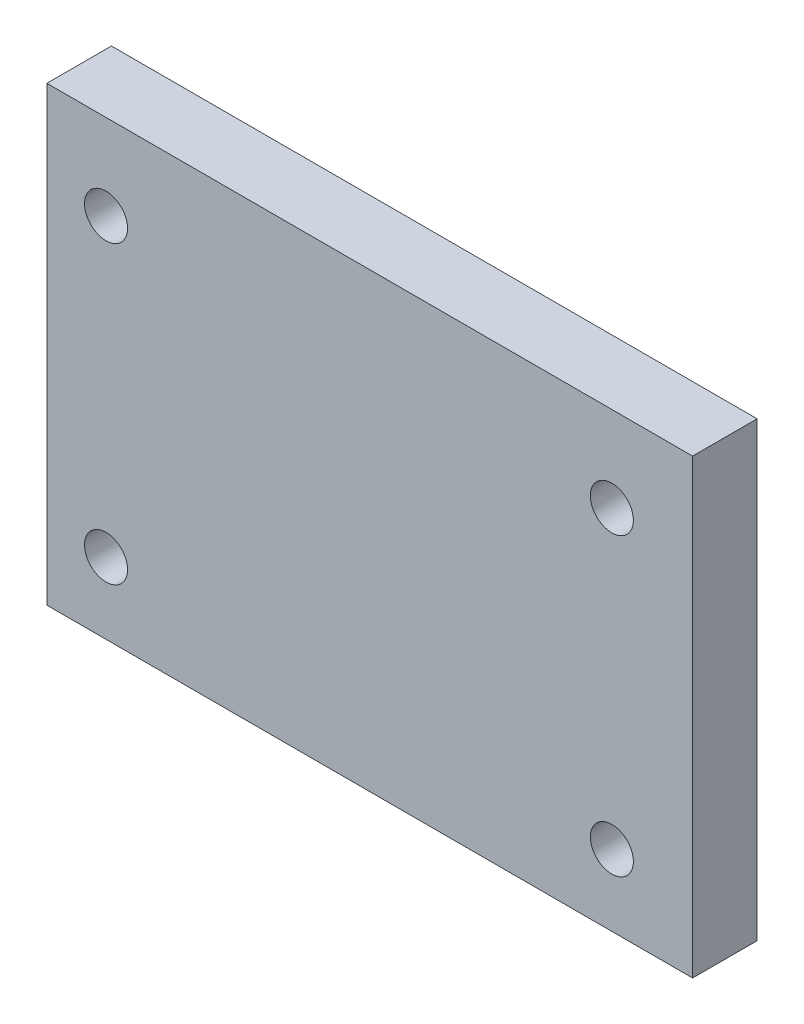
ISO-10303-21;
HEADER;
FILE_DESCRIPTION(('STEP AP214'),'2;1');
FILE_NAME('part.step','',(''),(''),'','','');
FILE_SCHEMA(('AUTOMOTIVE_DESIGN { 1 0 10303 214 1 1 1 1 }'));
ENDSEC;
DATA;
#1=APPLICATION_CONTEXT('core data for automotive mechanical design processes');
#2=APPLICATION_PROTOCOL_DEFINITION('international standard','automotive_design',2000,#1);
#3=PRODUCT_CONTEXT('',#1,'mechanical');
#4=PRODUCT('Part','Part','',(#3));
#5=PRODUCT_RELATED_PRODUCT_CATEGORY('part','',(#4));
#6=PRODUCT_DEFINITION_FORMATION('','',#4);
#7=PRODUCT_DEFINITION_CONTEXT('part definition',#1,'design');
#8=PRODUCT_DEFINITION('design','',#6,#7);
#9=PRODUCT_DEFINITION_SHAPE('','',#8);
#10=(LENGTH_UNIT() NAMED_UNIT(*) SI_UNIT(.MILLI.,.METRE.));
#11=(NAMED_UNIT(*) PLANE_ANGLE_UNIT() SI_UNIT($,.RADIAN.));
#12=(NAMED_UNIT(*) SI_UNIT($,.STERADIAN.) SOLID_ANGLE_UNIT());
#13=UNCERTAINTY_MEASURE_WITH_UNIT(LENGTH_MEASURE(1.E-05),#10,'distance_accuracy_value','');
#14=(GEOMETRIC_REPRESENTATION_CONTEXT(3) GLOBAL_UNCERTAINTY_ASSIGNED_CONTEXT((#13)) GLOBAL_UNIT_ASSIGNED_CONTEXT((#10,
#11,#12)) REPRESENTATION_CONTEXT('',''));
#15=CARTESIAN_POINT('',(0.,0.,0.));
#16=DIRECTION('',(0.,0.,1.));
#17=DIRECTION('',(1.,0.,0.));
#18=AXIS2_PLACEMENT_3D('',#15,#16,#17);
#19=CARTESIAN_POINT('',(0.,0.,30.));
#20=DIRECTION('',(1.,0.,0.));
#21=DIRECTION('',(0.,0.,-1.));
#22=AXIS2_PLACEMENT_3D('',#19,#20,#21);
#23=PLANE('',#22);
#24=DIRECTION('',(0.,-1.,0.));
#25=VECTOR('',#24,1.);
#26=CARTESIAN_POINT('',(0.,0.,0.));
#27=LINE('',#26,#25);
#28=CARTESIAN_POINT('',(0.,210.,0.));
#29=VERTEX_POINT('',#28);
#30=CARTESIAN_POINT('',(0.,0.,0.));
#31=VERTEX_POINT('',#30);
#32=EDGE_CURVE('E96',#29,#31,#27,.T.);
#33=ORIENTED_EDGE('',*,*,#32,.T.);
#34=DIRECTION('',(0.,0.,-1.));
#35=VECTOR('',#34,1.);
#36=CARTESIAN_POINT('',(0.,0.,30.));
#37=LINE('',#36,#35);
#38=CARTESIAN_POINT('',(0.,0.,30.));
#39=VERTEX_POINT('',#38);
#40=EDGE_CURVE('E11',#39,#31,#37,.T.);
#41=ORIENTED_EDGE('',*,*,#40,.F.);
#42=DIRECTION('',(0.,-1.,0.));
#43=VECTOR('',#42,1.);
#44=CARTESIAN_POINT('',(0.,0.,30.));
#45=LINE('',#44,#43);
#46=CARTESIAN_POINT('',(0.,210.,30.));
#47=VERTEX_POINT('',#46);
#48=EDGE_CURVE('E84',#47,#39,#45,.T.);
#49=ORIENTED_EDGE('',*,*,#48,.F.);
#50=DIRECTION('',(0.,0.,-1.));
#51=VECTOR('',#50,1.);
#52=CARTESIAN_POINT('',(0.,210.,30.));
#53=LINE('',#52,#51);
#54=EDGE_CURVE('E92',#47,#29,#53,.T.);
#55=ORIENTED_EDGE('',*,*,#54,.T.);
#56=EDGE_LOOP('',(#33,#41,#49,#55));
#57=FACE_BOUND('',#56,.T.);
#58=ADVANCED_FACE('F33',(#57),#23,.F.);
#59=CARTESIAN_POINT('',(0.,0.,30.));
#60=DIRECTION('',(0.,1.,0.));
#61=DIRECTION('',(0.,0.,1.));
#62=AXIS2_PLACEMENT_3D('',#59,#60,#61);
#63=PLANE('',#62);
#64=DIRECTION('',(1.,0.,0.));
#65=VECTOR('',#64,1.);
#66=CARTESIAN_POINT('',(0.,0.,0.));
#67=LINE('',#66,#65);
#68=CARTESIAN_POINT('',(300.,0.,0.));
#69=VERTEX_POINT('',#68);
#70=EDGE_CURVE('E88',#31,#69,#67,.T.);
#71=ORIENTED_EDGE('',*,*,#70,.T.);
#72=DIRECTION('',(0.,0.,-1.));
#73=VECTOR('',#72,1.);
#74=CARTESIAN_POINT('',(300.,0.,30.));
#75=LINE('',#74,#73);
#76=CARTESIAN_POINT('',(300.,0.,30.));
#77=VERTEX_POINT('',#76);
#78=EDGE_CURVE('E41',#77,#69,#75,.T.);
#79=ORIENTED_EDGE('',*,*,#78,.F.);
#80=DIRECTION('',(1.,0.,0.));
#81=VECTOR('',#80,1.);
#82=CARTESIAN_POINT('',(0.,0.,30.));
#83=LINE('',#82,#81);
#84=EDGE_CURVE('E79',#39,#77,#83,.T.);
#85=ORIENTED_EDGE('',*,*,#84,.F.);
#86=ORIENTED_EDGE('',*,*,#40,.T.);
#87=EDGE_LOOP('',(#71,#79,#85,#86));
#88=FACE_BOUND('',#87,.T.);
#89=ADVANCED_FACE('F87',(#88),#63,.F.);
#90=CARTESIAN_POINT('',(300.,0.,30.));
#91=DIRECTION('',(-1.,0.,0.));
#92=DIRECTION('',(0.,0.,1.));
#93=AXIS2_PLACEMENT_3D('',#90,#91,#92);
#94=PLANE('',#93);
#95=DIRECTION('',(0.,1.,0.));
#96=VECTOR('',#95,1.);
#97=CARTESIAN_POINT('',(300.,0.,0.));
#98=LINE('',#97,#96);
#99=CARTESIAN_POINT('',(300.,210.,0.));
#100=VERTEX_POINT('',#99);
#101=EDGE_CURVE('E66',#69,#100,#98,.T.);
#102=ORIENTED_EDGE('',*,*,#101,.T.);
#103=DIRECTION('',(0.,0.,-1.));
#104=VECTOR('',#103,1.);
#105=CARTESIAN_POINT('',(300.,210.,30.));
#106=LINE('',#105,#104);
#107=CARTESIAN_POINT('',(300.,210.,30.));
#108=VERTEX_POINT('',#107);
#109=EDGE_CURVE('E89',#108,#100,#106,.T.);
#110=ORIENTED_EDGE('',*,*,#109,.F.);
#111=DIRECTION('',(0.,1.,0.));
#112=VECTOR('',#111,1.);
#113=CARTESIAN_POINT('',(300.,0.,30.));
#114=LINE('',#113,#112);
#115=EDGE_CURVE('E82',#77,#108,#114,.T.);
#116=ORIENTED_EDGE('',*,*,#115,.F.);
#117=ORIENTED_EDGE('',*,*,#78,.T.);
#118=EDGE_LOOP('',(#102,#110,#116,#117));
#119=FACE_BOUND('',#118,.T.);
#120=ADVANCED_FACE('F90',(#119),#94,.F.);
#121=CARTESIAN_POINT('',(0.,210.,30.));
#122=DIRECTION('',(0.,-1.,0.));
#123=DIRECTION('',(0.,0.,-1.));
#124=AXIS2_PLACEMENT_3D('',#121,#122,#123);
#125=PLANE('',#124);
#126=DIRECTION('',(-1.,0.,0.));
#127=VECTOR('',#126,1.);
#128=CARTESIAN_POINT('',(0.,210.,0.));
#129=LINE('',#128,#127);
#130=EDGE_CURVE('E72',#100,#29,#129,.T.);
#131=ORIENTED_EDGE('',*,*,#130,.T.);
#132=ORIENTED_EDGE('',*,*,#54,.F.);
#133=DIRECTION('',(-1.,0.,0.));
#134=VECTOR('',#133,1.);
#135=CARTESIAN_POINT('',(0.,210.,30.));
#136=LINE('',#135,#134);
#137=EDGE_CURVE('E49',#108,#47,#136,.T.);
#138=ORIENTED_EDGE('',*,*,#137,.F.);
#139=ORIENTED_EDGE('',*,*,#109,.T.);
#140=EDGE_LOOP('',(#131,#132,#138,#139));
#141=FACE_BOUND('',#140,.T.);
#142=ADVANCED_FACE('F104',(#141),#125,.F.);
#143=CARTESIAN_POINT('',(0.,0.,30.));
#144=DIRECTION('',(0.,0.,-1.));
#145=DIRECTION('',(-1.,0.,0.));
#146=AXIS2_PLACEMENT_3D('',#143,#144,#145);
#147=PLANE('',#146);
#148=CARTESIAN_POINT('',(262.500000473212,33.0558854320608,30.));
#149=DIRECTION('',(0.,0.,-1.));
#150=DIRECTION('',(-1.,0.,0.));
#151=AXIS2_PLACEMENT_3D('',#148,#149,#150);
#152=CIRCLE('',#151,9.99999999999998);
#153=CARTESIAN_POINT('',(252.500000473212,33.0558854320608,30.));
#154=VERTEX_POINT('',#153);
#155=EDGE_CURVE('E119',#154,#154,#152,.T.);
#156=ORIENTED_EDGE('',*,*,#155,.T.);
#157=EDGE_LOOP('',(#156));
#158=FACE_BOUND('',#157,.T.);
#159=CARTESIAN_POINT('',(262.500000473212,170.355885432061,30.));
#160=DIRECTION('',(0.,0.,-1.));
#161=DIRECTION('',(-1.,0.,0.));
#162=AXIS2_PLACEMENT_3D('',#159,#160,#161);
#163=CIRCLE('',#162,9.99999999999998);
#164=CARTESIAN_POINT('',(252.500000473212,170.355885432061,30.));
#165=VERTEX_POINT('',#164);
#166=EDGE_CURVE('E125',#165,#165,#163,.T.);
#167=ORIENTED_EDGE('',*,*,#166,.T.);
#168=EDGE_LOOP('',(#167));
#169=FACE_BOUND('',#168,.T.);
#170=CARTESIAN_POINT('',(27.4999999999934,170.355885432061,30.));
#171=DIRECTION('',(0.,0.,-1.));
#172=DIRECTION('',(-1.,0.,0.));
#173=AXIS2_PLACEMENT_3D('',#170,#171,#172);
#174=CIRCLE('',#173,10.);
#175=CARTESIAN_POINT('',(17.4999999999933,170.355885432061,30.));
#176=VERTEX_POINT('',#175);
#177=EDGE_CURVE('E113',#176,#176,#174,.T.);
#178=ORIENTED_EDGE('',*,*,#177,.T.);
#179=EDGE_LOOP('',(#178));
#180=FACE_BOUND('',#179,.T.);
#181=CARTESIAN_POINT('',(27.4999999999935,33.0558854320606,30.));
#182=DIRECTION('',(0.,0.,-1.));
#183=DIRECTION('',(-1.,0.,0.));
#184=AXIS2_PLACEMENT_3D('',#181,#182,#183);
#185=CIRCLE('',#184,9.99999999999994);
#186=CARTESIAN_POINT('',(17.4999999999935,33.0558854320606,30.));
#187=VERTEX_POINT('',#186);
#188=EDGE_CURVE('E99',#187,#187,#185,.T.);
#189=ORIENTED_EDGE('',*,*,#188,.T.);
#190=EDGE_LOOP('',(#189));
#191=FACE_BOUND('',#190,.T.);
#192=ORIENTED_EDGE('',*,*,#48,.T.);
#193=ORIENTED_EDGE('',*,*,#84,.T.);
#194=ORIENTED_EDGE('',*,*,#115,.T.);
#195=ORIENTED_EDGE('',*,*,#137,.T.);
#196=EDGE_LOOP('',(#192,#193,#194,#195));
#197=FACE_BOUND('',#196,.T.);
#198=ADVANCED_FACE('F80',(#158,#169,#180,#191,#197),#147,.F.);
#199=CARTESIAN_POINT('',(0.,0.,0.));
#200=DIRECTION('',(0.,0.,-1.));
#201=DIRECTION('',(-1.,0.,0.));
#202=AXIS2_PLACEMENT_3D('',#199,#200,#201);
#203=PLANE('',#202);
#204=CARTESIAN_POINT('',(262.500000473212,33.0558854320608,0.));
#205=DIRECTION('',(0.,0.,-1.));
#206=DIRECTION('',(-1.,0.,0.));
#207=AXIS2_PLACEMENT_3D('',#204,#205,#206);
#208=CIRCLE('',#207,9.99999999999998);
#209=CARTESIAN_POINT('',(252.500000473212,33.0558854320608,0.));
#210=VERTEX_POINT('',#209);
#211=EDGE_CURVE('E116',#210,#210,#208,.T.);
#212=ORIENTED_EDGE('',*,*,#211,.F.);
#213=EDGE_LOOP('',(#212));
#214=FACE_BOUND('',#213,.T.);
#215=CARTESIAN_POINT('',(262.500000473212,170.355885432061,0.));
#216=DIRECTION('',(0.,0.,-1.));
#217=DIRECTION('',(-1.,0.,0.));
#218=AXIS2_PLACEMENT_3D('',#215,#216,#217);
#219=CIRCLE('',#218,9.99999999999998);
#220=CARTESIAN_POINT('',(252.500000473212,170.355885432061,0.));
#221=VERTEX_POINT('',#220);
#222=EDGE_CURVE('E122',#221,#221,#219,.T.);
#223=ORIENTED_EDGE('',*,*,#222,.F.);
#224=EDGE_LOOP('',(#223));
#225=FACE_BOUND('',#224,.T.);
#226=CARTESIAN_POINT('',(27.4999999999934,170.355885432061,0.));
#227=DIRECTION('',(0.,0.,-1.));
#228=DIRECTION('',(-1.,0.,0.));
#229=AXIS2_PLACEMENT_3D('',#226,#227,#228);
#230=CIRCLE('',#229,10.);
#231=CARTESIAN_POINT('',(17.4999999999933,170.355885432061,0.));
#232=VERTEX_POINT('',#231);
#233=EDGE_CURVE('E128',#232,#232,#230,.T.);
#234=ORIENTED_EDGE('',*,*,#233,.F.);
#235=EDGE_LOOP('',(#234));
#236=FACE_BOUND('',#235,.T.);
#237=CARTESIAN_POINT('',(27.4999999999935,33.0558854320606,0.));
#238=DIRECTION('',(0.,0.,-1.));
#239=DIRECTION('',(-1.,0.,0.));
#240=AXIS2_PLACEMENT_3D('',#237,#238,#239);
#241=CIRCLE('',#240,9.99999999999994);
#242=CARTESIAN_POINT('',(17.4999999999935,33.0558854320606,0.));
#243=VERTEX_POINT('',#242);
#244=EDGE_CURVE('E110',#243,#243,#241,.T.);
#245=ORIENTED_EDGE('',*,*,#244,.F.);
#246=EDGE_LOOP('',(#245));
#247=FACE_BOUND('',#246,.T.);
#248=ORIENTED_EDGE('',*,*,#32,.F.);
#249=ORIENTED_EDGE('',*,*,#130,.F.);
#250=ORIENTED_EDGE('',*,*,#101,.F.);
#251=ORIENTED_EDGE('',*,*,#70,.F.);
#252=EDGE_LOOP('',(#248,#249,#250,#251));
#253=FACE_BOUND('',#252,.T.);
#254=ADVANCED_FACE('F107',(#214,#225,#236,#247,#253),#203,.T.);
#255=CARTESIAN_POINT('',(27.4999999999935,33.0558854320606,30.));
#256=DIRECTION('',(0.,0.,-1.));
#257=DIRECTION('',(-1.,0.,0.));
#258=AXIS2_PLACEMENT_3D('',#255,#256,#257);
#259=CYLINDRICAL_SURFACE('',#258,9.99999999999994);
#260=ORIENTED_EDGE('',*,*,#188,.F.);
#261=EDGE_LOOP('',(#260));
#262=FACE_BOUND('',#261,.T.);
#263=ORIENTED_EDGE('',*,*,#244,.T.);
#264=EDGE_LOOP('',(#263));
#265=FACE_BOUND('',#264,.T.);
#266=ADVANCED_FACE('F140',(#262,#265),#259,.F.);
#267=CARTESIAN_POINT('',(27.4999999999934,170.355885432061,30.));
#268=DIRECTION('',(0.,0.,-1.));
#269=DIRECTION('',(-1.,0.,0.));
#270=AXIS2_PLACEMENT_3D('',#267,#268,#269);
#271=CYLINDRICAL_SURFACE('',#270,10.);
#272=ORIENTED_EDGE('',*,*,#177,.F.);
#273=EDGE_LOOP('',(#272));
#274=FACE_BOUND('',#273,.T.);
#275=ORIENTED_EDGE('',*,*,#233,.T.);
#276=EDGE_LOOP('',(#275));
#277=FACE_BOUND('',#276,.T.);
#278=ADVANCED_FACE('F136',(#274,#277),#271,.F.);
#279=CARTESIAN_POINT('',(262.500000473212,170.355885432061,30.));
#280=DIRECTION('',(0.,0.,-1.));
#281=DIRECTION('',(-1.,0.,0.));
#282=AXIS2_PLACEMENT_3D('',#279,#280,#281);
#283=CYLINDRICAL_SURFACE('',#282,9.99999999999998);
#284=ORIENTED_EDGE('',*,*,#166,.F.);
#285=EDGE_LOOP('',(#284));
#286=FACE_BOUND('',#285,.T.);
#287=ORIENTED_EDGE('',*,*,#222,.T.);
#288=EDGE_LOOP('',(#287));
#289=FACE_BOUND('',#288,.T.);
#290=ADVANCED_FACE('F139',(#286,#289),#283,.F.);
#291=CARTESIAN_POINT('',(262.500000473212,33.0558854320608,30.));
#292=DIRECTION('',(0.,0.,-1.));
#293=DIRECTION('',(-1.,0.,0.));
#294=AXIS2_PLACEMENT_3D('',#291,#292,#293);
#295=CYLINDRICAL_SURFACE('',#294,9.99999999999998);
#296=ORIENTED_EDGE('',*,*,#155,.F.);
#297=EDGE_LOOP('',(#296));
#298=FACE_BOUND('',#297,.T.);
#299=ORIENTED_EDGE('',*,*,#211,.T.);
#300=EDGE_LOOP('',(#299));
#301=FACE_BOUND('',#300,.T.);
#302=ADVANCED_FACE('F178',(#298,#301),#295,.F.);
#303=CLOSED_SHELL('',(#58,#89,#120,#142,#198,#254,#266,#278,#290,#302));
#304=MANIFOLD_SOLID_BREP('B2',#303);
#305=ADVANCED_BREP_SHAPE_REPRESENTATION('',(#18,#304),#14);
#306=SHAPE_DEFINITION_REPRESENTATION(#9,#305);
ENDSEC;
END-ISO-10303-21;
